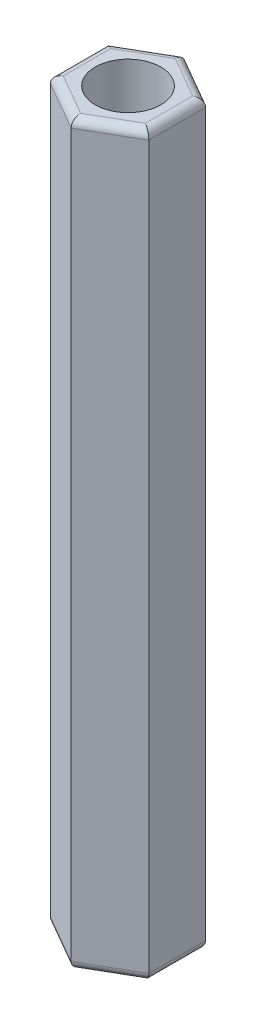
ISO-10303-21;
HEADER;
FILE_DESCRIPTION(('STEP AP214'),'2;1');
FILE_NAME('part.step','',(''),(''),'','','');
FILE_SCHEMA(('AUTOMOTIVE_DESIGN { 1 0 10303 214 1 1 1 1 }'));
ENDSEC;
DATA;
#1=APPLICATION_CONTEXT('core data for automotive mechanical design processes');
#2=APPLICATION_PROTOCOL_DEFINITION('international standard','automotive_design',2000,#1);
#3=PRODUCT_CONTEXT('',#1,'mechanical');
#4=PRODUCT('Part','Part','',(#3));
#5=PRODUCT_RELATED_PRODUCT_CATEGORY('part','',(#4));
#6=PRODUCT_DEFINITION_FORMATION('','',#4);
#7=PRODUCT_DEFINITION_CONTEXT('part definition',#1,'design');
#8=PRODUCT_DEFINITION('design','',#6,#7);
#9=PRODUCT_DEFINITION_SHAPE('','',#8);
#10=(LENGTH_UNIT() NAMED_UNIT(*) SI_UNIT(.MILLI.,.METRE.));
#11=(NAMED_UNIT(*) PLANE_ANGLE_UNIT() SI_UNIT($,.RADIAN.));
#12=(NAMED_UNIT(*) SI_UNIT($,.STERADIAN.) SOLID_ANGLE_UNIT());
#13=UNCERTAINTY_MEASURE_WITH_UNIT(LENGTH_MEASURE(1.E-05),#10,'distance_accuracy_value','');
#14=(GEOMETRIC_REPRESENTATION_CONTEXT(3) GLOBAL_UNCERTAINTY_ASSIGNED_CONTEXT((#13)) GLOBAL_UNIT_ASSIGNED_CONTEXT((#10,
#11,#12)) REPRESENTATION_CONTEXT('',''));
#15=CARTESIAN_POINT('',(0.,0.,0.));
#16=DIRECTION('',(0.,0.,1.));
#17=DIRECTION('',(1.,0.,0.));
#18=AXIS2_PLACEMENT_3D('',#15,#16,#17);
#19=CARTESIAN_POINT('',(0.,45.,0.));
#20=DIRECTION('',(0.,1.,0.));
#21=DIRECTION('',(0.,0.,1.));
#22=AXIS2_PLACEMENT_3D('',#19,#20,#21);
#23=PLANE('',#22);
#24=DIRECTION('',(0.,0.,1.));
#25=VECTOR('',#24,1.);
#26=CARTESIAN_POINT('',(-2.5,45.,1.73205080756888));
#27=LINE('',#26,#25);
#28=CARTESIAN_POINT('',(-2.5,45.,-1.44337567297407));
#29=VERTEX_POINT('',#28);
#30=CARTESIAN_POINT('',(-2.5,45.,1.44337567297406));
#31=VERTEX_POINT('',#30);
#32=EDGE_CURVE('E44',#29,#31,#27,.T.);
#33=ORIENTED_EDGE('',*,*,#32,.T.);
#34=DIRECTION('',(0.866025403784439,0.,0.5));
#35=VECTOR('',#34,1.);
#36=CARTESIAN_POINT('',(0.249999999999999,45.,3.03108891324554));
#37=LINE('',#36,#35);
#38=CARTESIAN_POINT('',(0.,45.,2.88675134594813));
#39=VERTEX_POINT('',#38);
#40=EDGE_CURVE('E11',#31,#39,#37,.T.);
#41=ORIENTED_EDGE('',*,*,#40,.T.);
#42=DIRECTION('',(0.866025403784439,0.,-0.5));
#43=VECTOR('',#42,1.);
#44=CARTESIAN_POINT('',(2.75,45.,1.29903810567666));
#45=LINE('',#44,#43);
#46=CARTESIAN_POINT('',(2.5,45.,1.44337567297406));
#47=VERTEX_POINT('',#46);
#48=EDGE_CURVE('E160',#39,#47,#45,.T.);
#49=ORIENTED_EDGE('',*,*,#48,.T.);
#50=DIRECTION('',(0.,0.,-1.));
#51=VECTOR('',#50,1.);
#52=CARTESIAN_POINT('',(2.5,45.,-1.73205080756888));
#53=LINE('',#52,#51);
#54=CARTESIAN_POINT('',(2.5,45.,-1.44337567297407));
#55=VERTEX_POINT('',#54);
#56=EDGE_CURVE('E257',#47,#55,#53,.T.);
#57=ORIENTED_EDGE('',*,*,#56,.T.);
#58=DIRECTION('',(-0.866025403784439,0.,-0.5));
#59=VECTOR('',#58,1.);
#60=CARTESIAN_POINT('',(-0.250000000000001,45.,-3.03108891324554));
#61=LINE('',#60,#59);
#62=CARTESIAN_POINT('',(0.,45.,-2.88675134594813));
#63=VERTEX_POINT('',#62);
#64=EDGE_CURVE('E259',#55,#63,#61,.T.);
#65=ORIENTED_EDGE('',*,*,#64,.T.);
#66=DIRECTION('',(-0.866025403784439,0.,0.5));
#67=VECTOR('',#66,1.);
#68=CARTESIAN_POINT('',(-2.75,45.,-1.29903810567666));
#69=LINE('',#68,#67);
#70=EDGE_CURVE('E55',#63,#29,#69,.T.);
#71=ORIENTED_EDGE('',*,*,#70,.T.);
#72=EDGE_LOOP('',(#33,#41,#49,#57,#65,#71));
#73=FACE_BOUND('',#72,.T.);
#74=CARTESIAN_POINT('',(0.,45.,0.));
#75=DIRECTION('',(0.,1.,0.));
#76=DIRECTION('',(0.,0.,1.));
#77=AXIS2_PLACEMENT_3D('',#74,#75,#76);
#78=CIRCLE('',#77,2.);
#79=CARTESIAN_POINT('',(0.,45.,-2.));
#80=VERTEX_POINT('',#79);
#81=EDGE_CURVE('E149',#80,#80,#78,.T.);
#82=ORIENTED_EDGE('',*,*,#81,.F.);
#83=EDGE_LOOP('',(#82));
#84=FACE_BOUND('',#83,.T.);
#85=ADVANCED_FACE('F35',(#73,#84),#23,.T.);
#86=CARTESIAN_POINT('',(0.,0.,0.));
#87=DIRECTION('',(0.,1.,0.));
#88=DIRECTION('',(0.,0.,1.));
#89=AXIS2_PLACEMENT_3D('',#86,#87,#88);
#90=PLANE('',#89);
#91=DIRECTION('',(0.866025403784439,0.,-0.5));
#92=VECTOR('',#91,1.);
#93=CARTESIAN_POINT('',(1.25,0.,2.1650635094611));
#94=LINE('',#93,#92);
#95=CARTESIAN_POINT('',(2.5,0.,1.44337567297406));
#96=VERTEX_POINT('',#95);
#97=CARTESIAN_POINT('',(0.,0.,2.88675134594813));
#98=VERTEX_POINT('',#97);
#99=EDGE_CURVE('E235',#96,#98,#94,.F.);
#100=ORIENTED_EDGE('',*,*,#99,.T.);
#101=DIRECTION('',(0.866025403784439,0.,0.5));
#102=VECTOR('',#101,1.);
#103=CARTESIAN_POINT('',(-1.25,0.,2.1650635094611));
#104=LINE('',#103,#102);
#105=CARTESIAN_POINT('',(-2.5,0.,1.44337567297406));
#106=VERTEX_POINT('',#105);
#107=EDGE_CURVE('E136',#98,#106,#104,.F.);
#108=ORIENTED_EDGE('',*,*,#107,.T.);
#109=DIRECTION('',(0.,0.,1.));
#110=VECTOR('',#109,1.);
#111=CARTESIAN_POINT('',(-2.5,0.,0.));
#112=LINE('',#111,#110);
#113=CARTESIAN_POINT('',(-2.5,0.,-1.44337567297407));
#114=VERTEX_POINT('',#113);
#115=EDGE_CURVE('E227',#106,#114,#112,.F.);
#116=ORIENTED_EDGE('',*,*,#115,.T.);
#117=DIRECTION('',(-0.866025403784439,0.,0.5));
#118=VECTOR('',#117,1.);
#119=CARTESIAN_POINT('',(-1.25,0.,-2.1650635094611));
#120=LINE('',#119,#118);
#121=CARTESIAN_POINT('',(0.,0.,-2.88675134594813));
#122=VERTEX_POINT('',#121);
#123=EDGE_CURVE('E229',#114,#122,#120,.F.);
#124=ORIENTED_EDGE('',*,*,#123,.T.);
#125=DIRECTION('',(-0.866025403784439,0.,-0.5));
#126=VECTOR('',#125,1.);
#127=CARTESIAN_POINT('',(1.25,0.,-2.1650635094611));
#128=LINE('',#127,#126);
#129=CARTESIAN_POINT('',(2.5,0.,-1.44337567297407));
#130=VERTEX_POINT('',#129);
#131=EDGE_CURVE('E231',#122,#130,#128,.F.);
#132=ORIENTED_EDGE('',*,*,#131,.T.);
#133=DIRECTION('',(0.,0.,-1.));
#134=VECTOR('',#133,1.);
#135=CARTESIAN_POINT('',(2.5,0.,0.));
#136=LINE('',#135,#134);
#137=EDGE_CURVE('E233',#130,#96,#136,.F.);
#138=ORIENTED_EDGE('',*,*,#137,.T.);
#139=EDGE_LOOP('',(#100,#108,#116,#124,#132,#138));
#140=FACE_BOUND('',#139,.T.);
#141=CARTESIAN_POINT('',(0.,0.,0.));
#142=DIRECTION('',(0.,1.,0.));
#143=DIRECTION('',(0.,0.,1.));
#144=AXIS2_PLACEMENT_3D('',#141,#142,#143);
#145=CIRCLE('',#144,2.);
#146=CARTESIAN_POINT('',(0.,0.,-2.));
#147=VERTEX_POINT('',#146);
#148=EDGE_CURVE('E203',#147,#147,#145,.T.);
#149=ORIENTED_EDGE('',*,*,#148,.T.);
#150=EDGE_LOOP('',(#149));
#151=FACE_BOUND('',#150,.T.);
#152=ADVANCED_FACE('F303',(#140,#151),#90,.F.);
#153=CARTESIAN_POINT('',(0.,45.,3.46410161513776));
#154=DIRECTION('',(-0.5,0.,-0.866025403784439));
#155=DIRECTION('',(-0.866025403784439,0.,0.5));
#156=AXIS2_PLACEMENT_3D('',#153,#154,#155);
#157=PLANE('',#156);
#158=DIRECTION('',(0.,-1.,0.));
#159=VECTOR('',#158,1.);
#160=CARTESIAN_POINT('',(0.,45.,3.46410161513776));
#161=LINE('',#160,#159);
#162=CARTESIAN_POINT('',(0.,44.5,3.46410161513776));
#163=VERTEX_POINT('',#162);
#164=CARTESIAN_POINT('',(0.,0.500000000000014,3.46410161513776));
#165=VERTEX_POINT('',#164);
#166=EDGE_CURVE('E128',#163,#165,#161,.T.);
#167=ORIENTED_EDGE('',*,*,#166,.T.);
#168=DIRECTION('',(0.866025403784439,0.,-0.5));
#169=VECTOR('',#168,1.);
#170=CARTESIAN_POINT('',(0.,0.5,3.46410161513776));
#171=LINE('',#170,#169);
#172=CARTESIAN_POINT('',(3.,0.500000000000014,1.73205080756888));
#173=VERTEX_POINT('',#172);
#174=EDGE_CURVE('E135',#165,#173,#171,.T.);
#175=ORIENTED_EDGE('',*,*,#174,.T.);
#176=DIRECTION('',(0.,-1.,0.));
#177=VECTOR('',#176,1.);
#178=CARTESIAN_POINT('',(3.,45.,1.73205080756888));
#179=LINE('',#178,#177);
#180=CARTESIAN_POINT('',(3.,44.5,1.73205080756888));
#181=VERTEX_POINT('',#180);
#182=EDGE_CURVE('E130',#181,#173,#179,.T.);
#183=ORIENTED_EDGE('',*,*,#182,.F.);
#184=DIRECTION('',(0.866025403784439,0.,-0.5));
#185=VECTOR('',#184,1.);
#186=CARTESIAN_POINT('',(0.,44.5,3.46410161513776));
#187=LINE('',#186,#185);
#188=EDGE_CURVE('E125',#181,#163,#187,.F.);
#189=ORIENTED_EDGE('',*,*,#188,.T.);
#190=EDGE_LOOP('',(#167,#175,#183,#189));
#191=FACE_BOUND('',#190,.T.);
#192=ADVANCED_FACE('F127',(#191),#157,.F.);
#193=CARTESIAN_POINT('',(3.,45.,1.73205080756888));
#194=DIRECTION('',(-1.,0.,0.));
#195=DIRECTION('',(0.,0.,1.));
#196=AXIS2_PLACEMENT_3D('',#193,#194,#195);
#197=PLANE('',#196);
#198=ORIENTED_EDGE('',*,*,#182,.T.);
#199=DIRECTION('',(0.,0.,-1.));
#200=VECTOR('',#199,1.);
#201=CARTESIAN_POINT('',(3.,0.5,1.73205080756888));
#202=LINE('',#201,#200);
#203=CARTESIAN_POINT('',(3.,0.500000000000014,-1.73205080756888));
#204=VERTEX_POINT('',#203);
#205=EDGE_CURVE('E242',#173,#204,#202,.T.);
#206=ORIENTED_EDGE('',*,*,#205,.T.);
#207=DIRECTION('',(0.,-1.,0.));
#208=VECTOR('',#207,1.);
#209=CARTESIAN_POINT('',(3.,45.,-1.73205080756888));
#210=LINE('',#209,#208);
#211=CARTESIAN_POINT('',(3.,44.5,-1.73205080756888));
#212=VERTEX_POINT('',#211);
#213=EDGE_CURVE('E222',#212,#204,#210,.T.);
#214=ORIENTED_EDGE('',*,*,#213,.F.);
#215=DIRECTION('',(0.,0.,-1.));
#216=VECTOR('',#215,1.);
#217=CARTESIAN_POINT('',(3.,44.5,1.73205080756888));
#218=LINE('',#217,#216);
#219=EDGE_CURVE('E240',#212,#181,#218,.F.);
#220=ORIENTED_EDGE('',*,*,#219,.T.);
#221=EDGE_LOOP('',(#198,#206,#214,#220));
#222=FACE_BOUND('',#221,.T.);
#223=ADVANCED_FACE('F271',(#222),#197,.F.);
#224=CARTESIAN_POINT('',(3.,45.,-1.73205080756888));
#225=DIRECTION('',(-0.5,0.,0.866025403784438));
#226=DIRECTION('',(0.866025403784439,0.,0.5));
#227=AXIS2_PLACEMENT_3D('',#224,#225,#226);
#228=PLANE('',#227);
#229=ORIENTED_EDGE('',*,*,#213,.T.);
#230=DIRECTION('',(-0.866025403784439,0.,-0.5));
#231=VECTOR('',#230,1.);
#232=CARTESIAN_POINT('',(3.,0.5,-1.73205080756888));
#233=LINE('',#232,#231);
#234=CARTESIAN_POINT('',(0.,0.500000000000014,-3.46410161513776));
#235=VERTEX_POINT('',#234);
#236=EDGE_CURVE('E246',#204,#235,#233,.T.);
#237=ORIENTED_EDGE('',*,*,#236,.T.);
#238=DIRECTION('',(0.,-1.,0.));
#239=VECTOR('',#238,1.);
#240=CARTESIAN_POINT('',(0.,45.,-3.46410161513776));
#241=LINE('',#240,#239);
#242=CARTESIAN_POINT('',(0.,44.5,-3.46410161513776));
#243=VERTEX_POINT('',#242);
#244=EDGE_CURVE('E219',#243,#235,#241,.T.);
#245=ORIENTED_EDGE('',*,*,#244,.F.);
#246=DIRECTION('',(-0.866025403784439,0.,-0.5));
#247=VECTOR('',#246,1.);
#248=CARTESIAN_POINT('',(3.,44.5,-1.73205080756888));
#249=LINE('',#248,#247);
#250=EDGE_CURVE('E244',#243,#212,#249,.F.);
#251=ORIENTED_EDGE('',*,*,#250,.T.);
#252=EDGE_LOOP('',(#229,#237,#245,#251));
#253=FACE_BOUND('',#252,.T.);
#254=ADVANCED_FACE('F274',(#253),#228,.F.);
#255=CARTESIAN_POINT('',(0.,45.,-3.46410161513776));
#256=DIRECTION('',(0.5,0.,0.866025403784439));
#257=DIRECTION('',(0.866025403784439,0.,-0.5));
#258=AXIS2_PLACEMENT_3D('',#255,#256,#257);
#259=PLANE('',#258);
#260=ORIENTED_EDGE('',*,*,#244,.T.);
#261=DIRECTION('',(-0.866025403784439,0.,0.5));
#262=VECTOR('',#261,1.);
#263=CARTESIAN_POINT('',(0.,0.5,-3.46410161513776));
#264=LINE('',#263,#262);
#265=CARTESIAN_POINT('',(-3.,0.500000000000014,-1.73205080756888));
#266=VERTEX_POINT('',#265);
#267=EDGE_CURVE('E250',#235,#266,#264,.T.);
#268=ORIENTED_EDGE('',*,*,#267,.T.);
#269=DIRECTION('',(0.,-1.,0.));
#270=VECTOR('',#269,1.);
#271=CARTESIAN_POINT('',(-3.,45.,-1.73205080756888));
#272=LINE('',#271,#270);
#273=CARTESIAN_POINT('',(-3.,44.5,-1.73205080756888));
#274=VERTEX_POINT('',#273);
#275=EDGE_CURVE('E216',#274,#266,#272,.T.);
#276=ORIENTED_EDGE('',*,*,#275,.F.);
#277=DIRECTION('',(-0.866025403784439,0.,0.5));
#278=VECTOR('',#277,1.);
#279=CARTESIAN_POINT('',(0.,44.5,-3.46410161513776));
#280=LINE('',#279,#278);
#281=EDGE_CURVE('E248',#274,#243,#280,.F.);
#282=ORIENTED_EDGE('',*,*,#281,.T.);
#283=EDGE_LOOP('',(#260,#268,#276,#282));
#284=FACE_BOUND('',#283,.T.);
#285=ADVANCED_FACE('F284',(#284),#259,.F.);
#286=CARTESIAN_POINT('',(-3.,45.,-1.73205080756888));
#287=DIRECTION('',(1.,0.,0.));
#288=DIRECTION('',(0.,0.,-1.));
#289=AXIS2_PLACEMENT_3D('',#286,#287,#288);
#290=PLANE('',#289);
#291=ORIENTED_EDGE('',*,*,#275,.T.);
#292=DIRECTION('',(0.,0.,1.));
#293=VECTOR('',#292,1.);
#294=CARTESIAN_POINT('',(-3.,0.5,-1.73205080756888));
#295=LINE('',#294,#293);
#296=CARTESIAN_POINT('',(-3.,0.500000000000014,1.73205080756888));
#297=VERTEX_POINT('',#296);
#298=EDGE_CURVE('E254',#266,#297,#295,.T.);
#299=ORIENTED_EDGE('',*,*,#298,.T.);
#300=DIRECTION('',(0.,-1.,0.));
#301=VECTOR('',#300,1.);
#302=CARTESIAN_POINT('',(-3.,45.,1.73205080756888));
#303=LINE('',#302,#301);
#304=CARTESIAN_POINT('',(-3.,44.5,1.73205080756888));
#305=VERTEX_POINT('',#304);
#306=EDGE_CURVE('E148',#305,#297,#303,.T.);
#307=ORIENTED_EDGE('',*,*,#306,.F.);
#308=DIRECTION('',(0.,0.,1.));
#309=VECTOR('',#308,1.);
#310=CARTESIAN_POINT('',(-3.,44.5,-1.73205080756888));
#311=LINE('',#310,#309);
#312=EDGE_CURVE('E252',#305,#274,#311,.F.);
#313=ORIENTED_EDGE('',*,*,#312,.T.);
#314=EDGE_LOOP('',(#291,#299,#307,#313));
#315=FACE_BOUND('',#314,.T.);
#316=ADVANCED_FACE('F286',(#315),#290,.F.);
#317=CARTESIAN_POINT('',(-3.,45.,1.73205080756888));
#318=DIRECTION('',(0.5,0.,-0.866025403784439));
#319=DIRECTION('',(-0.866025403784439,0.,-0.5));
#320=AXIS2_PLACEMENT_3D('',#317,#318,#319);
#321=PLANE('',#320);
#322=ORIENTED_EDGE('',*,*,#306,.T.);
#323=DIRECTION('',(0.866025403784439,0.,0.5));
#324=VECTOR('',#323,1.);
#325=CARTESIAN_POINT('',(-3.,0.5,1.73205080756888));
#326=LINE('',#325,#324);
#327=EDGE_CURVE('E147',#297,#165,#326,.T.);
#328=ORIENTED_EDGE('',*,*,#327,.T.);
#329=ORIENTED_EDGE('',*,*,#166,.F.);
#330=DIRECTION('',(0.866025403784439,0.,0.5));
#331=VECTOR('',#330,1.);
#332=CARTESIAN_POINT('',(-3.,44.5,1.73205080756888));
#333=LINE('',#332,#331);
#334=EDGE_CURVE('E144',#163,#305,#333,.F.);
#335=ORIENTED_EDGE('',*,*,#334,.T.);
#336=EDGE_LOOP('',(#322,#328,#329,#335));
#337=FACE_BOUND('',#336,.T.);
#338=ADVANCED_FACE('F143',(#337),#321,.F.);
#339=CARTESIAN_POINT('',(0.,45.,0.));
#340=DIRECTION('',(0.,-1.,0.));
#341=DIRECTION('',(0.,0.,-1.));
#342=AXIS2_PLACEMENT_3D('',#339,#340,#341);
#343=CYLINDRICAL_SURFACE('',#342,2.);
#344=CARTESIAN_POINT('',(0.,45.,-2.));
#345=CARTESIAN_POINT('',(0.,44.53125,-2.));
#346=CARTESIAN_POINT('',(0.,44.0625,-2.));
#347=CARTESIAN_POINT('',(0.,43.125,-2.));
#348=CARTESIAN_POINT('',(0.,42.65625,-2.));
#349=CARTESIAN_POINT('',(0.,41.71875,-2.));
#350=CARTESIAN_POINT('',(0.,41.25,-2.));
#351=CARTESIAN_POINT('',(0.,40.3125,-2.));
#352=CARTESIAN_POINT('',(0.,39.84375,-2.));
#353=CARTESIAN_POINT('',(0.,38.90625,-2.));
#354=CARTESIAN_POINT('',(0.,38.4375,-2.));
#355=CARTESIAN_POINT('',(0.,37.5,-2.));
#356=CARTESIAN_POINT('',(0.,37.03125,-2.));
#357=CARTESIAN_POINT('',(0.,36.09375,-2.));
#358=CARTESIAN_POINT('',(0.,35.625,-2.));
#359=CARTESIAN_POINT('',(0.,34.6875,-2.));
#360=CARTESIAN_POINT('',(0.,34.21875,-2.));
#361=CARTESIAN_POINT('',(0.,33.28125,-2.));
#362=CARTESIAN_POINT('',(0.,32.8125,-2.));
#363=CARTESIAN_POINT('',(0.,31.875,-2.));
#364=CARTESIAN_POINT('',(0.,31.40625,-2.));
#365=CARTESIAN_POINT('',(0.,30.46875,-2.));
#366=CARTESIAN_POINT('',(0.,30.,-2.));
#367=CARTESIAN_POINT('',(0.,29.0625,-2.));
#368=CARTESIAN_POINT('',(0.,28.59375,-2.));
#369=CARTESIAN_POINT('',(0.,27.65625,-2.));
#370=CARTESIAN_POINT('',(0.,27.1875,-2.));
#371=CARTESIAN_POINT('',(0.,26.25,-2.));
#372=CARTESIAN_POINT('',(0.,25.78125,-2.));
#373=CARTESIAN_POINT('',(0.,24.84375,-2.));
#374=CARTESIAN_POINT('',(0.,24.375,-2.));
#375=CARTESIAN_POINT('',(0.,23.4375,-2.));
#376=CARTESIAN_POINT('',(0.,22.96875,-2.));
#377=CARTESIAN_POINT('',(0.,22.03125,-2.));
#378=CARTESIAN_POINT('',(0.,21.5625,-2.));
#379=CARTESIAN_POINT('',(0.,20.625,-2.));
#380=CARTESIAN_POINT('',(0.,20.15625,-2.));
#381=CARTESIAN_POINT('',(0.,19.21875,-2.));
#382=CARTESIAN_POINT('',(0.,18.75,-2.));
#383=CARTESIAN_POINT('',(0.,17.8125,-2.));
#384=CARTESIAN_POINT('',(0.,17.34375,-2.));
#385=CARTESIAN_POINT('',(0.,16.40625,-2.));
#386=CARTESIAN_POINT('',(0.,15.9375,-2.));
#387=CARTESIAN_POINT('',(0.,15.,-2.));
#388=CARTESIAN_POINT('',(0.,14.53125,-2.));
#389=CARTESIAN_POINT('',(0.,13.59375,-2.));
#390=CARTESIAN_POINT('',(0.,13.125,-2.));
#391=CARTESIAN_POINT('',(0.,12.1875,-2.));
#392=CARTESIAN_POINT('',(0.,11.71875,-2.));
#393=CARTESIAN_POINT('',(0.,10.78125,-2.));
#394=CARTESIAN_POINT('',(0.,10.3125,-2.));
#395=CARTESIAN_POINT('',(0.,9.37499999999999,-2.));
#396=CARTESIAN_POINT('',(0.,8.90624999999999,-2.));
#397=CARTESIAN_POINT('',(0.,7.96874999999999,-2.));
#398=CARTESIAN_POINT('',(0.,7.5,-2.));
#399=CARTESIAN_POINT('',(0.,6.56249999999999,-2.));
#400=CARTESIAN_POINT('',(0.,6.09374999999999,-2.));
#401=CARTESIAN_POINT('',(0.,5.15624999999999,-2.));
#402=CARTESIAN_POINT('',(0.,4.68749999999999,-2.));
#403=CARTESIAN_POINT('',(0.,3.74999999999999,-2.));
#404=CARTESIAN_POINT('',(0.,3.28124999999999,-2.));
#405=CARTESIAN_POINT('',(0.,2.34374999999999,-2.));
#406=CARTESIAN_POINT('',(0.,1.87499999999999,-2.));
#407=CARTESIAN_POINT('',(0.,0.937499999999992,-2.));
#408=CARTESIAN_POINT('',(0.,0.468749999999993,-2.));
#409=CARTESIAN_POINT('',(0.,0.,-2.));
#410=B_SPLINE_CURVE_WITH_KNOTS('',3,(#344,#345,#346,#347,#348,#349,#350,#351,#352,#353,#354,
#355,#356,#357,#358,#359,#360,#361,#362,#363,#364,#365,#366,#367,#368,#369,#370,#371,#372,#373,
#374,#375,#376,#377,#378,#379,#380,#381,#382,#383,#384,#385,#386,#387,#388,#389,#390,#391,#392,
#393,#394,#395,#396,#397,#398,#399,#400,#401,#402,#403,#404,#405,#406,#407,#408,#409),
.UNSPECIFIED.,.F.,.F.,(4,2,2,2,2,2,2,2,2,2,2,2,2,2,2,2,2,2,2,2,2,2,2,2,2,2,2,2,2,2,2,2,4),(0.,
1.40625,2.8125,4.21874999999999,5.625,7.03125,8.43749999999999,9.84375,11.25,12.65625,14.0625,
15.46875,16.875,18.28125,19.6875,21.09375,22.5,23.90625,25.3125,26.71875,28.125,29.53125,
30.9375,32.34375,33.75,35.15625,36.5625,37.96875,39.375,40.78125,42.1875,43.59375,45.),.UNSPECIFIED.);
#411=EDGE_CURVE('BSEAM311',#80,#147,#410,.T.);
#412=ORIENTED_EDGE('',*,*,#81,.T.);
#413=ORIENTED_EDGE('',*,*,#148,.F.);
#414=ORIENTED_EDGE('',*,*,#411,.T.);
#415=ORIENTED_EDGE('',*,*,#411,.F.);
#416=EDGE_LOOP('',(#412,#414,#413,#415));
#417=FACE_BOUND('',#416,.T.);
#418=ADVANCED_FACE('F311',(#417),#343,.F.);
#419=CARTESIAN_POINT('',(2.75,0.5,-1.29903810567666));
#420=DIRECTION('',(-0.866025403784439,0.,-0.5));
#421=DIRECTION('',(-0.5,0.,0.866025403784438));
#422=AXIS2_PLACEMENT_3D('',#419,#420,#421);
#423=CYLINDRICAL_SURFACE('',#422,0.5);
#424=CARTESIAN_POINT('',(2.5,0.5,-1.44337567297407));
#425=DIRECTION('',(-0.5,0.,-0.866025403784439));
#426=DIRECTION('',(-0.866025403784439,0.,0.5));
#427=AXIS2_PLACEMENT_3D('',#424,#425,#426);
#428=ELLIPSE('',#427,0.577350269189626,0.5);
#429=EDGE_CURVE('E196',#130,#204,#428,.F.);
#430=ORIENTED_EDGE('',*,*,#429,.F.);
#431=ORIENTED_EDGE('',*,*,#131,.F.);
#432=CARTESIAN_POINT('',(0.,0.5,-2.88675134594813));
#433=DIRECTION('',(-1.,0.,0.));
#434=DIRECTION('',(0.,0.,1.));
#435=AXIS2_PLACEMENT_3D('',#432,#433,#434);
#436=ELLIPSE('',#435,0.577350269189626,0.5);
#437=EDGE_CURVE('E165',#235,#122,#436,.T.);
#438=ORIENTED_EDGE('',*,*,#437,.F.);
#439=ORIENTED_EDGE('',*,*,#236,.F.);
#440=EDGE_LOOP('',(#430,#431,#438,#439));
#441=FACE_BOUND('',#440,.T.);
#442=ADVANCED_FACE('F277',(#441),#423,.T.);
#443=CARTESIAN_POINT('',(0.25,0.5,-3.03108891324554));
#444=DIRECTION('',(-0.866025403784439,0.,0.5));
#445=DIRECTION('',(0.5,0.,0.866025403784439));
#446=AXIS2_PLACEMENT_3D('',#443,#444,#445);
#447=CYLINDRICAL_SURFACE('',#446,0.5);
#448=ORIENTED_EDGE('',*,*,#437,.T.);
#449=ORIENTED_EDGE('',*,*,#123,.F.);
#450=CARTESIAN_POINT('',(-2.5,0.5,-1.44337567297407));
#451=DIRECTION('',(-0.5,0.,0.866025403784439));
#452=DIRECTION('',(0.866025403784439,0.,0.5));
#453=AXIS2_PLACEMENT_3D('',#450,#451,#452);
#454=ELLIPSE('',#453,0.577350269189626,0.5);
#455=EDGE_CURVE('E194',#266,#114,#454,.T.);
#456=ORIENTED_EDGE('',*,*,#455,.F.);
#457=ORIENTED_EDGE('',*,*,#267,.F.);
#458=EDGE_LOOP('',(#448,#449,#456,#457));
#459=FACE_BOUND('',#458,.T.);
#460=ADVANCED_FACE('F280',(#459),#447,.T.);
#461=CARTESIAN_POINT('',(2.5,0.5,1.73205080756888));
#462=DIRECTION('',(0.,0.,-1.));
#463=DIRECTION('',(-1.,0.,0.));
#464=AXIS2_PLACEMENT_3D('',#461,#462,#463);
#465=CYLINDRICAL_SURFACE('',#464,0.5);
#466=ORIENTED_EDGE('',*,*,#429,.T.);
#467=ORIENTED_EDGE('',*,*,#205,.F.);
#468=CARTESIAN_POINT('',(2.5,0.5,1.44337567297406));
#469=DIRECTION('',(0.5,0.,-0.866025403784439));
#470=DIRECTION('',(-0.866025403784439,0.,-0.5));
#471=AXIS2_PLACEMENT_3D('',#468,#469,#470);
#472=ELLIPSE('',#471,0.577350269189626,0.5);
#473=EDGE_CURVE('E188',#96,#173,#472,.F.);
#474=ORIENTED_EDGE('',*,*,#473,.F.);
#475=ORIENTED_EDGE('',*,*,#137,.F.);
#476=EDGE_LOOP('',(#466,#467,#474,#475));
#477=FACE_BOUND('',#476,.T.);
#478=ADVANCED_FACE('F365',(#477),#465,.T.);
#479=CARTESIAN_POINT('',(-2.5,0.5,-1.73205080756888));
#480=DIRECTION('',(0.,0.,1.));
#481=DIRECTION('',(1.,0.,0.));
#482=AXIS2_PLACEMENT_3D('',#479,#480,#481);
#483=CYLINDRICAL_SURFACE('',#482,0.5);
#484=ORIENTED_EDGE('',*,*,#455,.T.);
#485=ORIENTED_EDGE('',*,*,#115,.F.);
#486=CARTESIAN_POINT('',(-2.5,0.5,1.44337567297406));
#487=DIRECTION('',(0.5,0.,0.866025403784439));
#488=DIRECTION('',(-0.866025403784439,0.,0.5));
#489=AXIS2_PLACEMENT_3D('',#486,#487,#488);
#490=ELLIPSE('',#489,0.577350269189626,0.5);
#491=EDGE_CURVE('E182',#297,#106,#490,.T.);
#492=ORIENTED_EDGE('',*,*,#491,.F.);
#493=ORIENTED_EDGE('',*,*,#298,.F.);
#494=EDGE_LOOP('',(#484,#485,#492,#493));
#495=FACE_BOUND('',#494,.T.);
#496=ADVANCED_FACE('F290',(#495),#483,.T.);
#497=CARTESIAN_POINT('',(-0.250000000000001,0.5,3.03108891324554));
#498=DIRECTION('',(0.866025403784439,0.,-0.5));
#499=DIRECTION('',(-0.5,0.,-0.866025403784439));
#500=AXIS2_PLACEMENT_3D('',#497,#498,#499);
#501=CYLINDRICAL_SURFACE('',#500,0.5);
#502=ORIENTED_EDGE('',*,*,#473,.T.);
#503=ORIENTED_EDGE('',*,*,#174,.F.);
#504=CARTESIAN_POINT('',(0.,0.5,2.88675134594813));
#505=DIRECTION('',(1.,0.,0.));
#506=DIRECTION('',(0.,0.,-1.));
#507=AXIS2_PLACEMENT_3D('',#504,#505,#506);
#508=ELLIPSE('',#507,0.577350269189626,0.5);
#509=EDGE_CURVE('E178',#98,#165,#508,.F.);
#510=ORIENTED_EDGE('',*,*,#509,.F.);
#511=ORIENTED_EDGE('',*,*,#99,.F.);
#512=EDGE_LOOP('',(#502,#503,#510,#511));
#513=FACE_BOUND('',#512,.T.);
#514=ADVANCED_FACE('F293',(#513),#501,.T.);
#515=CARTESIAN_POINT('',(-2.75,0.5,1.29903810567666));
#516=DIRECTION('',(0.866025403784439,0.,0.5));
#517=DIRECTION('',(0.5,0.,-0.866025403784439));
#518=AXIS2_PLACEMENT_3D('',#515,#516,#517);
#519=CYLINDRICAL_SURFACE('',#518,0.5);
#520=ORIENTED_EDGE('',*,*,#491,.T.);
#521=ORIENTED_EDGE('',*,*,#107,.F.);
#522=ORIENTED_EDGE('',*,*,#509,.T.);
#523=ORIENTED_EDGE('',*,*,#327,.F.);
#524=EDGE_LOOP('',(#520,#521,#522,#523));
#525=FACE_BOUND('',#524,.T.);
#526=ADVANCED_FACE('F291',(#525),#519,.T.);
#527=CARTESIAN_POINT('',(1.25,44.5,-2.1650635094611));
#528=DIRECTION('',(0.866025403784439,0.,0.5));
#529=DIRECTION('',(0.5,0.,-0.866025403784438));
#530=AXIS2_PLACEMENT_3D('',#527,#528,#529);
#531=CYLINDRICAL_SURFACE('',#530,0.5);
#532=CARTESIAN_POINT('',(2.5,44.5,-1.44337567297406));
#533=DIRECTION('',(0.5,0.,0.866025403784439));
#534=DIRECTION('',(-0.866025403784439,0.,0.5));
#535=AXIS2_PLACEMENT_3D('',#532,#533,#534);
#536=ELLIPSE('',#535,0.577350269189626,0.5);
#537=EDGE_CURVE('E171',#212,#55,#536,.T.);
#538=ORIENTED_EDGE('',*,*,#537,.F.);
#539=ORIENTED_EDGE('',*,*,#250,.F.);
#540=CARTESIAN_POINT('',(0.,44.5,-2.88675134594813));
#541=DIRECTION('',(1.,0.,0.));
#542=DIRECTION('',(0.,0.,1.));
#543=AXIS2_PLACEMENT_3D('',#540,#541,#542);
#544=ELLIPSE('',#543,0.577350269189626,0.5);
#545=EDGE_CURVE('E39',#63,#243,#544,.F.);
#546=ORIENTED_EDGE('',*,*,#545,.F.);
#547=ORIENTED_EDGE('',*,*,#64,.F.);
#548=EDGE_LOOP('',(#538,#539,#546,#547));
#549=FACE_BOUND('',#548,.T.);
#550=ADVANCED_FACE('F37',(#549),#531,.T.);
#551=CARTESIAN_POINT('',(-1.25,44.5,-2.1650635094611));
#552=DIRECTION('',(0.866025403784439,0.,-0.5));
#553=DIRECTION('',(-0.5,0.,-0.866025403784439));
#554=AXIS2_PLACEMENT_3D('',#551,#552,#553);
#555=CYLINDRICAL_SURFACE('',#554,0.5);
#556=ORIENTED_EDGE('',*,*,#545,.T.);
#557=ORIENTED_EDGE('',*,*,#281,.F.);
#558=CARTESIAN_POINT('',(-2.5,44.5,-1.44337567297407));
#559=DIRECTION('',(0.5,0.,-0.866025403784439));
#560=DIRECTION('',(0.866025403784439,0.,0.5));
#561=AXIS2_PLACEMENT_3D('',#558,#559,#560);
#562=ELLIPSE('',#561,0.577350269189626,0.5);
#563=EDGE_CURVE('E169',#29,#274,#562,.F.);
#564=ORIENTED_EDGE('',*,*,#563,.F.);
#565=ORIENTED_EDGE('',*,*,#70,.F.);
#566=EDGE_LOOP('',(#556,#557,#564,#565));
#567=FACE_BOUND('',#566,.T.);
#568=ADVANCED_FACE('F265',(#567),#555,.T.);
#569=CARTESIAN_POINT('',(2.5,44.5,0.));
#570=DIRECTION('',(0.,0.,1.));
#571=DIRECTION('',(1.,0.,0.));
#572=AXIS2_PLACEMENT_3D('',#569,#570,#571);
#573=CYLINDRICAL_SURFACE('',#572,0.5);
#574=ORIENTED_EDGE('',*,*,#537,.T.);
#575=ORIENTED_EDGE('',*,*,#56,.F.);
#576=CARTESIAN_POINT('',(2.5,44.5,1.44337567297407));
#577=DIRECTION('',(-0.5,0.,0.866025403784439));
#578=DIRECTION('',(-0.866025403784439,0.,-0.5));
#579=AXIS2_PLACEMENT_3D('',#576,#577,#578);
#580=ELLIPSE('',#579,0.577350269189626,0.5);
#581=EDGE_CURVE('E162',#181,#47,#580,.T.);
#582=ORIENTED_EDGE('',*,*,#581,.F.);
#583=ORIENTED_EDGE('',*,*,#219,.F.);
#584=EDGE_LOOP('',(#574,#575,#582,#583));
#585=FACE_BOUND('',#584,.T.);
#586=ADVANCED_FACE('F268',(#585),#573,.T.);
#587=CARTESIAN_POINT('',(-2.5,44.5,0.));
#588=DIRECTION('',(0.,0.,-1.));
#589=DIRECTION('',(-1.,0.,0.));
#590=AXIS2_PLACEMENT_3D('',#587,#588,#589);
#591=CYLINDRICAL_SURFACE('',#590,0.5);
#592=ORIENTED_EDGE('',*,*,#563,.T.);
#593=ORIENTED_EDGE('',*,*,#312,.F.);
#594=CARTESIAN_POINT('',(-2.5,44.5,1.44337567297406));
#595=DIRECTION('',(-0.5,0.,-0.866025403784439));
#596=DIRECTION('',(0.866025403784439,0.,-0.5));
#597=AXIS2_PLACEMENT_3D('',#594,#595,#596);
#598=ELLIPSE('',#597,0.577350269189626,0.5);
#599=EDGE_CURVE('E156',#31,#305,#598,.F.);
#600=ORIENTED_EDGE('',*,*,#599,.F.);
#601=ORIENTED_EDGE('',*,*,#32,.F.);
#602=EDGE_LOOP('',(#592,#593,#600,#601));
#603=FACE_BOUND('',#602,.T.);
#604=ADVANCED_FACE('F267',(#603),#591,.T.);
#605=CARTESIAN_POINT('',(1.25,44.5,2.1650635094611));
#606=DIRECTION('',(-0.866025403784439,0.,0.5));
#607=DIRECTION('',(0.5,0.,0.866025403784439));
#608=AXIS2_PLACEMENT_3D('',#605,#606,#607);
#609=CYLINDRICAL_SURFACE('',#608,0.5);
#610=ORIENTED_EDGE('',*,*,#581,.T.);
#611=ORIENTED_EDGE('',*,*,#48,.F.);
#612=CARTESIAN_POINT('',(0.,44.5,2.88675134594813));
#613=DIRECTION('',(-1.,0.,0.));
#614=DIRECTION('',(0.,0.,1.));
#615=AXIS2_PLACEMENT_3D('',#612,#613,#614);
#616=ELLIPSE('',#615,0.577350269189626,0.5);
#617=EDGE_CURVE('E154',#163,#39,#616,.T.);
#618=ORIENTED_EDGE('',*,*,#617,.F.);
#619=ORIENTED_EDGE('',*,*,#188,.F.);
#620=EDGE_LOOP('',(#610,#611,#618,#619));
#621=FACE_BOUND('',#620,.T.);
#622=ADVANCED_FACE('F159',(#621),#609,.T.);
#623=CARTESIAN_POINT('',(-1.25,44.5,2.1650635094611));
#624=DIRECTION('',(-0.866025403784439,0.,-0.5));
#625=DIRECTION('',(-0.5,0.,0.866025403784439));
#626=AXIS2_PLACEMENT_3D('',#623,#624,#625);
#627=CYLINDRICAL_SURFACE('',#626,0.5);
#628=ORIENTED_EDGE('',*,*,#599,.T.);
#629=ORIENTED_EDGE('',*,*,#334,.F.);
#630=ORIENTED_EDGE('',*,*,#617,.T.);
#631=ORIENTED_EDGE('',*,*,#40,.F.);
#632=EDGE_LOOP('',(#628,#629,#630,#631));
#633=FACE_BOUND('',#632,.T.);
#634=ADVANCED_FACE('F152',(#633),#627,.T.);
#635=CLOSED_SHELL('',(#85,#152,#192,#223,#254,#285,#316,#338,#418,#442,#460,#478,#496,#514,#526,
#550,#568,#586,#604,#622,#634));
#636=MANIFOLD_SOLID_BREP('B2',#635);
#637=ADVANCED_BREP_SHAPE_REPRESENTATION('',(#18,#636),#14);
#638=SHAPE_DEFINITION_REPRESENTATION(#9,#637);
ENDSEC;
END-ISO-10303-21;
